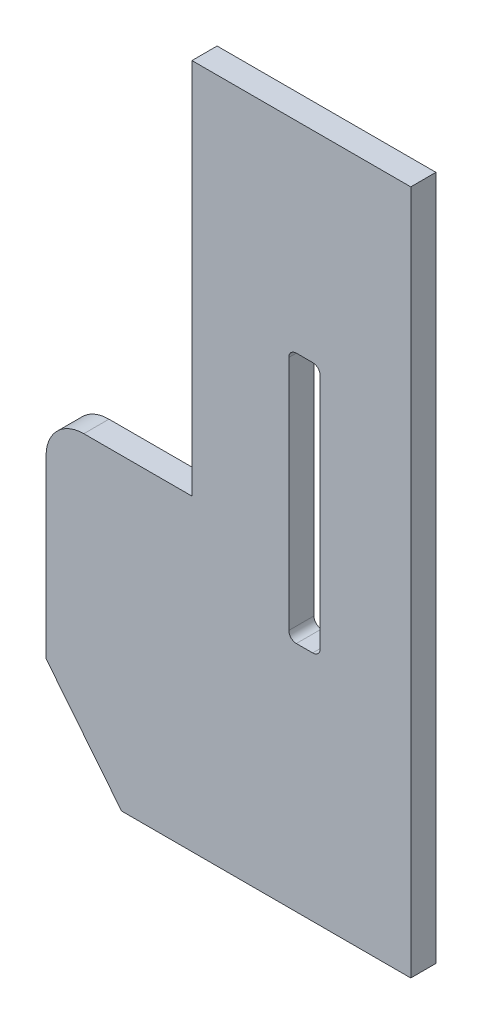
ISO-10303-21;
HEADER;
FILE_DESCRIPTION(('STEP AP214'),'2;1');
FILE_NAME('part.step','',(''),(''),'','','');
FILE_SCHEMA(('AUTOMOTIVE_DESIGN { 1 0 10303 214 1 1 1 1 }'));
ENDSEC;
DATA;
#1=APPLICATION_CONTEXT('core data for automotive mechanical design processes');
#2=APPLICATION_PROTOCOL_DEFINITION('international standard','automotive_design',2000,#1);
#3=PRODUCT_CONTEXT('',#1,'mechanical');
#4=PRODUCT('Part','Part','',(#3));
#5=PRODUCT_RELATED_PRODUCT_CATEGORY('part','',(#4));
#6=PRODUCT_DEFINITION_FORMATION('','',#4);
#7=PRODUCT_DEFINITION_CONTEXT('part definition',#1,'design');
#8=PRODUCT_DEFINITION('design','',#6,#7);
#9=PRODUCT_DEFINITION_SHAPE('','',#8);
#10=(LENGTH_UNIT() NAMED_UNIT(*) SI_UNIT(.MILLI.,.METRE.));
#11=(NAMED_UNIT(*) PLANE_ANGLE_UNIT() SI_UNIT($,.RADIAN.));
#12=(NAMED_UNIT(*) SI_UNIT($,.STERADIAN.) SOLID_ANGLE_UNIT());
#13=UNCERTAINTY_MEASURE_WITH_UNIT(LENGTH_MEASURE(1.E-05),#10,'distance_accuracy_value','');
#14=(GEOMETRIC_REPRESENTATION_CONTEXT(3) GLOBAL_UNCERTAINTY_ASSIGNED_CONTEXT((#13)) GLOBAL_UNIT_ASSIGNED_CONTEXT((#10,
#11,#12)) REPRESENTATION_CONTEXT('',''));
#15=CARTESIAN_POINT('',(0.,0.,0.));
#16=DIRECTION('',(0.,0.,1.));
#17=DIRECTION('',(1.,0.,0.));
#18=AXIS2_PLACEMENT_3D('',#15,#16,#17);
#19=CARTESIAN_POINT('',(-72.5,-136.217484798018,10.));
#20=DIRECTION('',(0.,1.,0.));
#21=DIRECTION('',(0.,0.,1.));
#22=AXIS2_PLACEMENT_3D('',#19,#20,#21);
#23=PLANE('',#22);
#24=DIRECTION('',(1.,0.,0.));
#25=VECTOR('',#24,1.);
#26=CARTESIAN_POINT('',(-72.5,-136.217484798018,10.));
#27=LINE('',#26,#25);
#28=CARTESIAN_POINT('',(-42.5,-136.217484798018,10.));
#29=VERTEX_POINT('',#28);
#30=CARTESIAN_POINT('',(72.5,-136.217484798018,10.));
#31=VERTEX_POINT('',#30);
#32=EDGE_CURVE('E171',#29,#31,#27,.T.);
#33=ORIENTED_EDGE('',*,*,#32,.F.);
#34=DIRECTION('',(0.,0.,-1.));
#35=VECTOR('',#34,1.);
#36=CARTESIAN_POINT('',(-42.5,-136.217484798018,10.));
#37=LINE('',#36,#35);
#38=CARTESIAN_POINT('',(-42.5,-136.217484798018,0.));
#39=VERTEX_POINT('',#38);
#40=EDGE_CURVE('E153',#29,#39,#37,.T.);
#41=ORIENTED_EDGE('',*,*,#40,.T.);
#42=DIRECTION('',(1.,0.,0.));
#43=VECTOR('',#42,1.);
#44=CARTESIAN_POINT('',(-72.5,-136.217484798018,0.));
#45=LINE('',#44,#43);
#46=CARTESIAN_POINT('',(72.5,-136.217484798018,0.));
#47=VERTEX_POINT('',#46);
#48=EDGE_CURVE('E193',#39,#47,#45,.T.);
#49=ORIENTED_EDGE('',*,*,#48,.T.);
#50=DIRECTION('',(0.,0.,-1.));
#51=VECTOR('',#50,1.);
#52=CARTESIAN_POINT('',(72.5,-136.217484798018,10.));
#53=LINE('',#52,#51);
#54=EDGE_CURVE('E177',#31,#47,#53,.T.);
#55=ORIENTED_EDGE('',*,*,#54,.F.);
#56=EDGE_LOOP('',(#33,#41,#49,#55));
#57=FACE_BOUND('',#56,.T.);
#58=ADVANCED_FACE('F39',(#57),#23,.F.);
#59=CARTESIAN_POINT('',(72.5,136.217484798018,10.));
#60=DIRECTION('',(1.,0.,0.));
#61=DIRECTION('',(0.,0.,-1.));
#62=AXIS2_PLACEMENT_3D('',#59,#60,#61);
#63=PLANE('',#62);
#64=DIRECTION('',(0.,-1.,0.));
#65=VECTOR('',#64,1.);
#66=CARTESIAN_POINT('',(72.5,136.217484798018,0.));
#67=LINE('',#66,#65);
#68=CARTESIAN_POINT('',(72.5,136.217484798018,0.));
#69=VERTEX_POINT('',#68);
#70=EDGE_CURVE('E195',#69,#47,#67,.T.);
#71=ORIENTED_EDGE('',*,*,#70,.F.);
#72=DIRECTION('',(0.,0.,-1.));
#73=VECTOR('',#72,1.);
#74=CARTESIAN_POINT('',(72.5,136.217484798018,10.));
#75=LINE('',#74,#73);
#76=CARTESIAN_POINT('',(72.5,136.217484798018,10.));
#77=VERTEX_POINT('',#76);
#78=EDGE_CURVE('E192',#77,#69,#75,.T.);
#79=ORIENTED_EDGE('',*,*,#78,.F.);
#80=DIRECTION('',(0.,-1.,0.));
#81=VECTOR('',#80,1.);
#82=CARTESIAN_POINT('',(72.5,136.217484798018,10.));
#83=LINE('',#82,#81);
#84=EDGE_CURVE('E179',#77,#31,#83,.T.);
#85=ORIENTED_EDGE('',*,*,#84,.T.);
#86=ORIENTED_EDGE('',*,*,#54,.T.);
#87=EDGE_LOOP('',(#71,#79,#85,#86));
#88=FACE_BOUND('',#87,.T.);
#89=ADVANCED_FACE('F309',(#88),#63,.T.);
#90=CARTESIAN_POINT('',(-72.5,136.217484798018,10.));
#91=DIRECTION('',(0.,1.,0.));
#92=DIRECTION('',(0.,0.,1.));
#93=AXIS2_PLACEMENT_3D('',#90,#91,#92);
#94=PLANE('',#93);
#95=DIRECTION('',(0.,0.,-1.));
#96=VECTOR('',#95,1.);
#97=CARTESIAN_POINT('',(-14.5,136.217484798018,10.));
#98=LINE('',#97,#96);
#99=CARTESIAN_POINT('',(-14.5,136.217484798018,10.));
#100=VERTEX_POINT('',#99);
#101=CARTESIAN_POINT('',(-14.5,136.217484798018,0.));
#102=VERTEX_POINT('',#101);
#103=EDGE_CURVE('E285',#100,#102,#98,.T.);
#104=ORIENTED_EDGE('',*,*,#103,.F.);
#105=DIRECTION('',(1.,0.,0.));
#106=VECTOR('',#105,1.);
#107=CARTESIAN_POINT('',(-72.5,136.217484798018,10.));
#108=LINE('',#107,#106);
#109=EDGE_CURVE('E182',#100,#77,#108,.T.);
#110=ORIENTED_EDGE('',*,*,#109,.T.);
#111=ORIENTED_EDGE('',*,*,#78,.T.);
#112=DIRECTION('',(1.,0.,0.));
#113=VECTOR('',#112,1.);
#114=CARTESIAN_POINT('',(-72.5,136.217484798018,0.));
#115=LINE('',#114,#113);
#116=EDGE_CURVE('E184',#102,#69,#115,.T.);
#117=ORIENTED_EDGE('',*,*,#116,.F.);
#118=EDGE_LOOP('',(#104,#110,#111,#117));
#119=FACE_BOUND('',#118,.T.);
#120=ADVANCED_FACE('F313',(#119),#94,.T.);
#121=CARTESIAN_POINT('',(-72.5,136.217484798018,10.));
#122=DIRECTION('',(1.,0.,0.));
#123=DIRECTION('',(0.,0.,-1.));
#124=AXIS2_PLACEMENT_3D('',#121,#122,#123);
#125=PLANE('',#124);
#126=DIRECTION('',(0.,-1.,0.));
#127=VECTOR('',#126,1.);
#128=CARTESIAN_POINT('',(-72.5,136.217484798018,10.));
#129=LINE('',#128,#127);
#130=CARTESIAN_POINT('',(-72.5,-28.7825152019822,10.));
#131=VERTEX_POINT('',#130);
#132=CARTESIAN_POINT('',(-72.5,-98.7825152019822,10.));
#133=VERTEX_POINT('',#132);
#134=EDGE_CURVE('E174',#131,#133,#129,.T.);
#135=ORIENTED_EDGE('',*,*,#134,.F.);
#136=DIRECTION('',(0.,0.,-1.));
#137=VECTOR('',#136,1.);
#138=CARTESIAN_POINT('',(-72.5,-28.7825152019822,10.));
#139=LINE('',#138,#137);
#140=CARTESIAN_POINT('',(-72.5,-28.7825152019822,0.));
#141=VERTEX_POINT('',#140);
#142=EDGE_CURVE('E202',#131,#141,#139,.T.);
#143=ORIENTED_EDGE('',*,*,#142,.T.);
#144=DIRECTION('',(0.,-1.,0.));
#145=VECTOR('',#144,1.);
#146=CARTESIAN_POINT('',(-72.5,136.217484798018,0.));
#147=LINE('',#146,#145);
#148=CARTESIAN_POINT('',(-72.5,-98.7825152019821,0.));
#149=VERTEX_POINT('',#148);
#150=EDGE_CURVE('E180',#141,#149,#147,.T.);
#151=ORIENTED_EDGE('',*,*,#150,.T.);
#152=DIRECTION('',(0.,0.,-1.));
#153=VECTOR('',#152,1.);
#154=CARTESIAN_POINT('',(-72.5,-98.7825152019822,10.));
#155=LINE('',#154,#153);
#156=EDGE_CURVE('E165',#133,#149,#155,.T.);
#157=ORIENTED_EDGE('',*,*,#156,.F.);
#158=EDGE_LOOP('',(#135,#143,#151,#157));
#159=FACE_BOUND('',#158,.T.);
#160=ADVANCED_FACE('F305',(#159),#125,.F.);
#161=CARTESIAN_POINT('',(0.,0.,10.));
#162=DIRECTION('',(0.,0.,-1.));
#163=DIRECTION('',(-1.,0.,0.));
#164=AXIS2_PLACEMENT_3D('',#161,#162,#163);
#165=PLANE('',#164);
#166=DIRECTION('',(0.,-1.,0.));
#167=VECTOR('',#166,1.);
#168=CARTESIAN_POINT('',(24.,0.,10.));
#169=LINE('',#168,#167);
#170=CARTESIAN_POINT('',(24.,53.2174847980178,10.));
#171=VERTEX_POINT('',#170);
#172=CARTESIAN_POINT('',(24.,-40.7825152019822,10.));
#173=VERTEX_POINT('',#172);
#174=EDGE_CURVE('E265',#171,#173,#169,.T.);
#175=ORIENTED_EDGE('',*,*,#174,.F.);
#176=CARTESIAN_POINT('',(27.,53.2174847980178,10.));
#177=DIRECTION('',(0.,0.,-1.));
#178=DIRECTION('',(-1.,0.,0.));
#179=AXIS2_PLACEMENT_3D('',#176,#177,#178);
#180=CIRCLE('',#179,3.);
#181=CARTESIAN_POINT('',(27.,56.2174847980178,10.));
#182=VERTEX_POINT('',#181);
#183=EDGE_CURVE('E61',#171,#182,#180,.T.);
#184=ORIENTED_EDGE('',*,*,#183,.T.);
#185=DIRECTION('',(1.,0.,0.));
#186=VECTOR('',#185,1.);
#187=CARTESIAN_POINT('',(0.,56.2174847980178,10.));
#188=LINE('',#187,#186);
#189=CARTESIAN_POINT('',(33.5,56.2174847980178,10.));
#190=VERTEX_POINT('',#189);
#191=EDGE_CURVE('E259',#182,#190,#188,.T.);
#192=ORIENTED_EDGE('',*,*,#191,.T.);
#193=CARTESIAN_POINT('',(33.5,53.2174847980178,10.));
#194=DIRECTION('',(0.,0.,-1.));
#195=DIRECTION('',(-1.,0.,0.));
#196=AXIS2_PLACEMENT_3D('',#193,#194,#195);
#197=CIRCLE('',#196,3.);
#198=CARTESIAN_POINT('',(36.5,53.2174847980178,10.));
#199=VERTEX_POINT('',#198);
#200=EDGE_CURVE('E11',#190,#199,#197,.T.);
#201=ORIENTED_EDGE('',*,*,#200,.T.);
#202=DIRECTION('',(0.,-1.,0.));
#203=VECTOR('',#202,1.);
#204=CARTESIAN_POINT('',(36.5,0.,10.));
#205=LINE('',#204,#203);
#206=CARTESIAN_POINT('',(36.5,-40.7825152019822,10.));
#207=VERTEX_POINT('',#206);
#208=EDGE_CURVE('E257',#199,#207,#205,.T.);
#209=ORIENTED_EDGE('',*,*,#208,.T.);
#210=CARTESIAN_POINT('',(33.5,-40.7825152019822,10.));
#211=DIRECTION('',(0.,0.,-1.));
#212=DIRECTION('',(-1.,0.,0.));
#213=AXIS2_PLACEMENT_3D('',#210,#211,#212);
#214=CIRCLE('',#213,3.);
#215=CARTESIAN_POINT('',(33.5,-43.7825152019822,10.));
#216=VERTEX_POINT('',#215);
#217=EDGE_CURVE('E232',#207,#216,#214,.T.);
#218=ORIENTED_EDGE('',*,*,#217,.T.);
#219=DIRECTION('',(1.,0.,0.));
#220=VECTOR('',#219,1.);
#221=CARTESIAN_POINT('',(0.,-43.7825152019822,10.));
#222=LINE('',#221,#220);
#223=CARTESIAN_POINT('',(27.,-43.7825152019822,10.));
#224=VERTEX_POINT('',#223);
#225=EDGE_CURVE('E273',#224,#216,#222,.T.);
#226=ORIENTED_EDGE('',*,*,#225,.F.);
#227=CARTESIAN_POINT('',(27.,-40.7825152019822,10.));
#228=DIRECTION('',(0.,0.,-1.));
#229=DIRECTION('',(-1.,0.,0.));
#230=AXIS2_PLACEMENT_3D('',#227,#228,#229);
#231=CIRCLE('',#230,3.);
#232=EDGE_CURVE('E236',#224,#173,#231,.T.);
#233=ORIENTED_EDGE('',*,*,#232,.T.);
#234=EDGE_LOOP('',(#175,#184,#192,#201,#209,#218,#226,#233));
#235=FACE_BOUND('',#234,.T.);
#236=DIRECTION('',(-1.,0.,0.));
#237=VECTOR('',#236,1.);
#238=CARTESIAN_POINT('',(0.,-13.7825152019822,10.));
#239=LINE('',#238,#237);
#240=CARTESIAN_POINT('',(-14.5,-13.7825152019822,10.));
#241=VERTEX_POINT('',#240);
#242=CARTESIAN_POINT('',(-57.5,-13.7825152019822,10.));
#243=VERTEX_POINT('',#242);
#244=EDGE_CURVE('E279',#241,#243,#239,.T.);
#245=ORIENTED_EDGE('',*,*,#244,.T.);
#246=CARTESIAN_POINT('',(-57.5,-28.7825152019822,10.));
#247=DIRECTION('',(0.,0.,-1.));
#248=DIRECTION('',(-1.,0.,0.));
#249=AXIS2_PLACEMENT_3D('',#246,#247,#248);
#250=CIRCLE('',#249,15.);
#251=EDGE_CURVE('E209',#243,#131,#250,.F.);
#252=ORIENTED_EDGE('',*,*,#251,.T.);
#253=ORIENTED_EDGE('',*,*,#134,.T.);
#254=DIRECTION('',(0.625356078177069,-0.780339525775157,0.));
#255=VECTOR('',#254,1.);
#256=CARTESIAN_POINT('',(-92.3522947850257,-74.010180145683,10.));
#257=LINE('',#256,#255);
#258=EDGE_CURVE('E157',#133,#29,#257,.T.);
#259=ORIENTED_EDGE('',*,*,#258,.T.);
#260=ORIENTED_EDGE('',*,*,#32,.T.);
#261=ORIENTED_EDGE('',*,*,#84,.F.);
#262=ORIENTED_EDGE('',*,*,#109,.F.);
#263=DIRECTION('',(0.,-1.,0.));
#264=VECTOR('',#263,1.);
#265=CARTESIAN_POINT('',(-14.5,0.,10.));
#266=LINE('',#265,#264);
#267=EDGE_CURVE('E281',#100,#241,#266,.T.);
#268=ORIENTED_EDGE('',*,*,#267,.T.);
#269=EDGE_LOOP('',(#245,#252,#253,#259,#260,#261,#262,#268));
#270=FACE_BOUND('',#269,.T.);
#271=ADVANCED_FACE('F169',(#235,#270),#165,.F.);
#272=CARTESIAN_POINT('',(0.,0.,0.));
#273=DIRECTION('',(0.,0.,-1.));
#274=DIRECTION('',(-1.,0.,0.));
#275=AXIS2_PLACEMENT_3D('',#272,#273,#274);
#276=PLANE('',#275);
#277=DIRECTION('',(0.,-1.,0.));
#278=VECTOR('',#277,1.);
#279=CARTESIAN_POINT('',(36.5,0.,0.));
#280=LINE('',#279,#278);
#281=CARTESIAN_POINT('',(36.5,53.2174847980178,0.));
#282=VERTEX_POINT('',#281);
#283=CARTESIAN_POINT('',(36.5,-40.7825152019822,0.));
#284=VERTEX_POINT('',#283);
#285=EDGE_CURVE('E247',#282,#284,#280,.T.);
#286=ORIENTED_EDGE('',*,*,#285,.F.);
#287=CARTESIAN_POINT('',(33.5,53.2174847980178,0.));
#288=DIRECTION('',(0.,0.,-1.));
#289=DIRECTION('',(-1.,0.,0.));
#290=AXIS2_PLACEMENT_3D('',#287,#288,#289);
#291=CIRCLE('',#290,3.);
#292=CARTESIAN_POINT('',(33.5,56.2174847980178,0.));
#293=VERTEX_POINT('',#292);
#294=EDGE_CURVE('E47',#282,#293,#291,.F.);
#295=ORIENTED_EDGE('',*,*,#294,.T.);
#296=DIRECTION('',(1.,0.,0.));
#297=VECTOR('',#296,1.);
#298=CARTESIAN_POINT('',(0.,56.2174847980178,0.));
#299=LINE('',#298,#297);
#300=CARTESIAN_POINT('',(27.,56.2174847980178,0.));
#301=VERTEX_POINT('',#300);
#302=EDGE_CURVE('E245',#301,#293,#299,.T.);
#303=ORIENTED_EDGE('',*,*,#302,.F.);
#304=CARTESIAN_POINT('',(27.,53.2174847980178,0.));
#305=DIRECTION('',(0.,0.,-1.));
#306=DIRECTION('',(-1.,0.,0.));
#307=AXIS2_PLACEMENT_3D('',#304,#305,#306);
#308=CIRCLE('',#307,3.);
#309=CARTESIAN_POINT('',(24.,53.2174847980178,0.));
#310=VERTEX_POINT('',#309);
#311=EDGE_CURVE('E238',#301,#310,#308,.F.);
#312=ORIENTED_EDGE('',*,*,#311,.T.);
#313=DIRECTION('',(0.,-1.,0.));
#314=VECTOR('',#313,1.);
#315=CARTESIAN_POINT('',(24.,0.,0.));
#316=LINE('',#315,#314);
#317=CARTESIAN_POINT('',(24.,-40.7825152019822,0.));
#318=VERTEX_POINT('',#317);
#319=EDGE_CURVE('E252',#310,#318,#316,.T.);
#320=ORIENTED_EDGE('',*,*,#319,.T.);
#321=CARTESIAN_POINT('',(27.,-40.7825152019822,0.));
#322=DIRECTION('',(0.,0.,-1.));
#323=DIRECTION('',(-1.,0.,0.));
#324=AXIS2_PLACEMENT_3D('',#321,#322,#323);
#325=CIRCLE('',#324,3.);
#326=CARTESIAN_POINT('',(27.,-43.7825152019822,0.));
#327=VERTEX_POINT('',#326);
#328=EDGE_CURVE('E234',#318,#327,#325,.F.);
#329=ORIENTED_EDGE('',*,*,#328,.T.);
#330=DIRECTION('',(1.,0.,0.));
#331=VECTOR('',#330,1.);
#332=CARTESIAN_POINT('',(0.,-43.7825152019822,0.));
#333=LINE('',#332,#331);
#334=CARTESIAN_POINT('',(33.5,-43.7825152019822,0.));
#335=VERTEX_POINT('',#334);
#336=EDGE_CURVE('E263',#327,#335,#333,.T.);
#337=ORIENTED_EDGE('',*,*,#336,.T.);
#338=CARTESIAN_POINT('',(33.5,-40.7825152019822,0.));
#339=DIRECTION('',(0.,0.,-1.));
#340=DIRECTION('',(-1.,0.,0.));
#341=AXIS2_PLACEMENT_3D('',#338,#339,#340);
#342=CIRCLE('',#341,3.);
#343=EDGE_CURVE('E230',#335,#284,#342,.F.);
#344=ORIENTED_EDGE('',*,*,#343,.T.);
#345=EDGE_LOOP('',(#286,#295,#303,#312,#320,#329,#337,#344));
#346=FACE_BOUND('',#345,.T.);
#347=ORIENTED_EDGE('',*,*,#150,.F.);
#348=CARTESIAN_POINT('',(-57.5,-28.7825152019822,0.));
#349=DIRECTION('',(0.,0.,-1.));
#350=DIRECTION('',(-1.,0.,0.));
#351=AXIS2_PLACEMENT_3D('',#348,#349,#350);
#352=CIRCLE('',#351,15.);
#353=CARTESIAN_POINT('',(-57.5,-13.7825152019822,0.));
#354=VERTEX_POINT('',#353);
#355=EDGE_CURVE('E205',#141,#354,#352,.T.);
#356=ORIENTED_EDGE('',*,*,#355,.T.);
#357=DIRECTION('',(-1.,0.,0.));
#358=VECTOR('',#357,1.);
#359=CARTESIAN_POINT('',(0.,-13.7825152019822,0.));
#360=LINE('',#359,#358);
#361=CARTESIAN_POINT('',(-14.5,-13.7825152019822,0.));
#362=VERTEX_POINT('',#361);
#363=EDGE_CURVE('E164',#362,#354,#360,.T.);
#364=ORIENTED_EDGE('',*,*,#363,.F.);
#365=DIRECTION('',(0.,-1.,0.));
#366=VECTOR('',#365,1.);
#367=CARTESIAN_POINT('',(-14.5,0.,0.));
#368=LINE('',#367,#366);
#369=EDGE_CURVE('E282',#102,#362,#368,.T.);
#370=ORIENTED_EDGE('',*,*,#369,.F.);
#371=ORIENTED_EDGE('',*,*,#116,.T.);
#372=ORIENTED_EDGE('',*,*,#70,.T.);
#373=ORIENTED_EDGE('',*,*,#48,.F.);
#374=DIRECTION('',(0.625356078177069,-0.780339525775157,0.));
#375=VECTOR('',#374,1.);
#376=CARTESIAN_POINT('',(-92.3522947850257,-74.010180145683,0.));
#377=LINE('',#376,#375);
#378=EDGE_CURVE('E160',#149,#39,#377,.T.);
#379=ORIENTED_EDGE('',*,*,#378,.F.);
#380=EDGE_LOOP('',(#347,#356,#364,#370,#371,#372,#373,#379));
#381=FACE_BOUND('',#380,.T.);
#382=ADVANCED_FACE('F243',(#346,#381),#276,.T.);
#383=CARTESIAN_POINT('',(0.,-13.7825152019822,10.));
#384=DIRECTION('',(0.,-1.,0.));
#385=DIRECTION('',(1.,0.,0.));
#386=AXIS2_PLACEMENT_3D('',#383,#384,#385);
#387=PLANE('',#386);
#388=ORIENTED_EDGE('',*,*,#363,.T.);
#389=DIRECTION('',(0.,0.,-1.));
#390=VECTOR('',#389,1.);
#391=CARTESIAN_POINT('',(-57.5,-13.7825152019822,10.));
#392=LINE('',#391,#390);
#393=EDGE_CURVE('E207',#354,#243,#392,.F.);
#394=ORIENTED_EDGE('',*,*,#393,.T.);
#395=ORIENTED_EDGE('',*,*,#244,.F.);
#396=DIRECTION('',(0.,0.,-1.));
#397=VECTOR('',#396,1.);
#398=CARTESIAN_POINT('',(-14.5,-13.7825152019822,10.));
#399=LINE('',#398,#397);
#400=EDGE_CURVE('E187',#241,#362,#399,.T.);
#401=ORIENTED_EDGE('',*,*,#400,.T.);
#402=EDGE_LOOP('',(#388,#394,#395,#401));
#403=FACE_BOUND('',#402,.T.);
#404=ADVANCED_FACE('F294',(#403),#387,.F.);
#405=CARTESIAN_POINT('',(-14.5,0.,10.));
#406=DIRECTION('',(1.,0.,0.));
#407=DIRECTION('',(0.,1.,0.));
#408=AXIS2_PLACEMENT_3D('',#405,#406,#407);
#409=PLANE('',#408);
#410=ORIENTED_EDGE('',*,*,#369,.T.);
#411=ORIENTED_EDGE('',*,*,#400,.F.);
#412=ORIENTED_EDGE('',*,*,#267,.F.);
#413=ORIENTED_EDGE('',*,*,#103,.T.);
#414=EDGE_LOOP('',(#410,#411,#412,#413));
#415=FACE_BOUND('',#414,.T.);
#416=ADVANCED_FACE('F297',(#415),#409,.F.);
#417=CARTESIAN_POINT('',(-92.3522947850257,-74.010180145683,10.));
#418=DIRECTION('',(0.780339525775157,0.625356078177069,0.));
#419=DIRECTION('',(-0.625356078177069,0.780339525775157,0.));
#420=AXIS2_PLACEMENT_3D('',#417,#418,#419);
#421=PLANE('',#420);
#422=ORIENTED_EDGE('',*,*,#378,.T.);
#423=ORIENTED_EDGE('',*,*,#40,.F.);
#424=ORIENTED_EDGE('',*,*,#258,.F.);
#425=ORIENTED_EDGE('',*,*,#156,.T.);
#426=EDGE_LOOP('',(#422,#423,#424,#425));
#427=FACE_BOUND('',#426,.T.);
#428=ADVANCED_FACE('F155',(#427),#421,.F.);
#429=CARTESIAN_POINT('',(36.5,0.,10.));
#430=DIRECTION('',(1.,0.,0.));
#431=DIRECTION('',(0.,1.,0.));
#432=AXIS2_PLACEMENT_3D('',#429,#430,#431);
#433=PLANE('',#432);
#434=ORIENTED_EDGE('',*,*,#285,.T.);
#435=DIRECTION('',(0.,0.,-1.));
#436=VECTOR('',#435,1.);
#437=CARTESIAN_POINT('',(36.5,-40.7825152019822,10.));
#438=LINE('',#437,#436);
#439=EDGE_CURVE('E219',#284,#207,#438,.F.);
#440=ORIENTED_EDGE('',*,*,#439,.T.);
#441=ORIENTED_EDGE('',*,*,#208,.F.);
#442=DIRECTION('',(0.,0.,-1.));
#443=VECTOR('',#442,1.);
#444=CARTESIAN_POINT('',(36.5,53.2174847980178,0.));
#445=LINE('',#444,#443);
#446=EDGE_CURVE('E216',#199,#282,#445,.T.);
#447=ORIENTED_EDGE('',*,*,#446,.T.);
#448=EDGE_LOOP('',(#434,#440,#441,#447));
#449=FACE_BOUND('',#448,.T.);
#450=ADVANCED_FACE('F261',(#449),#433,.F.);
#451=CARTESIAN_POINT('',(0.,56.2174847980178,10.));
#452=DIRECTION('',(0.,1.,0.));
#453=DIRECTION('',(0.,0.,1.));
#454=AXIS2_PLACEMENT_3D('',#451,#452,#453);
#455=PLANE('',#454);
#456=ORIENTED_EDGE('',*,*,#191,.F.);
#457=DIRECTION('',(0.,0.,-1.));
#458=VECTOR('',#457,1.);
#459=CARTESIAN_POINT('',(27.,56.2174847980178,10.));
#460=LINE('',#459,#458);
#461=EDGE_CURVE('E227',#182,#301,#460,.T.);
#462=ORIENTED_EDGE('',*,*,#461,.T.);
#463=ORIENTED_EDGE('',*,*,#302,.T.);
#464=DIRECTION('',(0.,0.,-1.));
#465=VECTOR('',#464,1.);
#466=CARTESIAN_POINT('',(33.5,56.2174847980178,10.));
#467=LINE('',#466,#465);
#468=EDGE_CURVE('E54',#293,#190,#467,.F.);
#469=ORIENTED_EDGE('',*,*,#468,.T.);
#470=EDGE_LOOP('',(#456,#462,#463,#469));
#471=FACE_BOUND('',#470,.T.);
#472=ADVANCED_FACE('F250',(#471),#455,.F.);
#473=CARTESIAN_POINT('',(24.,0.,10.));
#474=DIRECTION('',(1.,0.,0.));
#475=DIRECTION('',(0.,1.,0.));
#476=AXIS2_PLACEMENT_3D('',#473,#474,#475);
#477=PLANE('',#476);
#478=ORIENTED_EDGE('',*,*,#174,.T.);
#479=DIRECTION('',(0.,0.,-1.));
#480=VECTOR('',#479,1.);
#481=CARTESIAN_POINT('',(24.,-40.7825152019822,0.));
#482=LINE('',#481,#480);
#483=EDGE_CURVE('E223',#173,#318,#482,.T.);
#484=ORIENTED_EDGE('',*,*,#483,.T.);
#485=ORIENTED_EDGE('',*,*,#319,.F.);
#486=DIRECTION('',(0.,0.,-1.));
#487=VECTOR('',#486,1.);
#488=CARTESIAN_POINT('',(24.,53.2174847980178,10.));
#489=LINE('',#488,#487);
#490=EDGE_CURVE('E221',#310,#171,#489,.F.);
#491=ORIENTED_EDGE('',*,*,#490,.T.);
#492=EDGE_LOOP('',(#478,#484,#485,#491));
#493=FACE_BOUND('',#492,.T.);
#494=ADVANCED_FACE('F346',(#493),#477,.T.);
#495=CARTESIAN_POINT('',(0.,-43.7825152019822,10.));
#496=DIRECTION('',(0.,1.,0.));
#497=DIRECTION('',(-1.,0.,0.));
#498=AXIS2_PLACEMENT_3D('',#495,#496,#497);
#499=PLANE('',#498);
#500=ORIENTED_EDGE('',*,*,#225,.T.);
#501=DIRECTION('',(0.,0.,-1.));
#502=VECTOR('',#501,1.);
#503=CARTESIAN_POINT('',(33.5,-43.7825152019822,10.));
#504=LINE('',#503,#502);
#505=EDGE_CURVE('E213',#216,#335,#504,.T.);
#506=ORIENTED_EDGE('',*,*,#505,.T.);
#507=ORIENTED_EDGE('',*,*,#336,.F.);
#508=DIRECTION('',(0.,0.,-1.));
#509=VECTOR('',#508,1.);
#510=CARTESIAN_POINT('',(27.,-43.7825152019822,10.));
#511=LINE('',#510,#509);
#512=EDGE_CURVE('E211',#327,#224,#511,.F.);
#513=ORIENTED_EDGE('',*,*,#512,.T.);
#514=EDGE_LOOP('',(#500,#506,#507,#513));
#515=FACE_BOUND('',#514,.T.);
#516=ADVANCED_FACE('F330',(#515),#499,.T.);
#517=CARTESIAN_POINT('',(-57.5,-28.7825152019822,10.));
#518=DIRECTION('',(0.,0.,-1.));
#519=DIRECTION('',(-1.,0.,0.));
#520=AXIS2_PLACEMENT_3D('',#517,#518,#519);
#521=CYLINDRICAL_SURFACE('',#520,15.);
#522=ORIENTED_EDGE('',*,*,#251,.F.);
#523=ORIENTED_EDGE('',*,*,#393,.F.);
#524=ORIENTED_EDGE('',*,*,#355,.F.);
#525=ORIENTED_EDGE('',*,*,#142,.F.);
#526=EDGE_LOOP('',(#522,#523,#524,#525));
#527=FACE_BOUND('',#526,.T.);
#528=ADVANCED_FACE('F303',(#527),#521,.T.);
#529=CARTESIAN_POINT('',(33.5,-40.7825152019822,10.));
#530=DIRECTION('',(0.,0.,-1.));
#531=DIRECTION('',(-1.,0.,0.));
#532=AXIS2_PLACEMENT_3D('',#529,#530,#531);
#533=CYLINDRICAL_SURFACE('',#532,3.);
#534=ORIENTED_EDGE('',*,*,#217,.F.);
#535=ORIENTED_EDGE('',*,*,#439,.F.);
#536=ORIENTED_EDGE('',*,*,#343,.F.);
#537=ORIENTED_EDGE('',*,*,#505,.F.);
#538=EDGE_LOOP('',(#534,#535,#536,#537));
#539=FACE_BOUND('',#538,.T.);
#540=ADVANCED_FACE('F329',(#539),#533,.F.);
#541=CARTESIAN_POINT('',(27.,-40.7825152019822,10.));
#542=DIRECTION('',(0.,0.,1.));
#543=DIRECTION('',(1.,0.,0.));
#544=AXIS2_PLACEMENT_3D('',#541,#542,#543);
#545=CYLINDRICAL_SURFACE('',#544,3.);
#546=ORIENTED_EDGE('',*,*,#232,.F.);
#547=ORIENTED_EDGE('',*,*,#512,.F.);
#548=ORIENTED_EDGE('',*,*,#328,.F.);
#549=ORIENTED_EDGE('',*,*,#483,.F.);
#550=EDGE_LOOP('',(#546,#547,#548,#549));
#551=FACE_BOUND('',#550,.T.);
#552=ADVANCED_FACE('F333',(#551),#545,.F.);
#553=CARTESIAN_POINT('',(27.,53.2174847980178,10.));
#554=DIRECTION('',(0.,0.,-1.));
#555=DIRECTION('',(-1.,0.,0.));
#556=AXIS2_PLACEMENT_3D('',#553,#554,#555);
#557=CYLINDRICAL_SURFACE('',#556,3.);
#558=ORIENTED_EDGE('',*,*,#183,.F.);
#559=ORIENTED_EDGE('',*,*,#490,.F.);
#560=ORIENTED_EDGE('',*,*,#311,.F.);
#561=ORIENTED_EDGE('',*,*,#461,.F.);
#562=EDGE_LOOP('',(#558,#559,#560,#561));
#563=FACE_BOUND('',#562,.T.);
#564=ADVANCED_FACE('F336',(#563),#557,.F.);
#565=CARTESIAN_POINT('',(33.5,53.2174847980178,10.));
#566=DIRECTION('',(0.,0.,1.));
#567=DIRECTION('',(1.,0.,0.));
#568=AXIS2_PLACEMENT_3D('',#565,#566,#567);
#569=CYLINDRICAL_SURFACE('',#568,3.);
#570=ORIENTED_EDGE('',*,*,#200,.F.);
#571=ORIENTED_EDGE('',*,*,#468,.F.);
#572=ORIENTED_EDGE('',*,*,#294,.F.);
#573=ORIENTED_EDGE('',*,*,#446,.F.);
#574=EDGE_LOOP('',(#570,#571,#572,#573));
#575=FACE_BOUND('',#574,.T.);
#576=ADVANCED_FACE('F41',(#575),#569,.F.);
#577=CLOSED_SHELL('',(#58,#89,#120,#160,#271,#382,#404,#416,#428,#450,#472,#494,#516,#528,#540,
#552,#564,#576));
#578=MANIFOLD_SOLID_BREP('B2',#577);
#579=ADVANCED_BREP_SHAPE_REPRESENTATION('',(#18,#578),#14);
#580=SHAPE_DEFINITION_REPRESENTATION(#9,#579);
ENDSEC;
END-ISO-10303-21;
